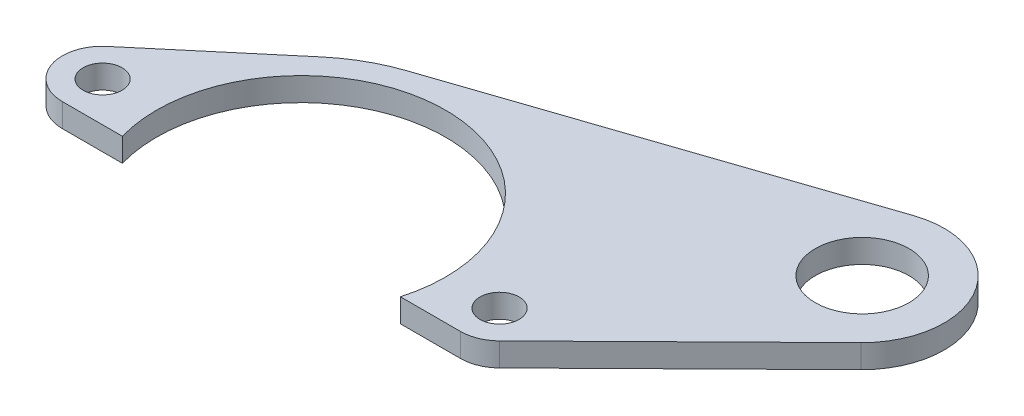
ISO-10303-21;
HEADER;
FILE_DESCRIPTION(('STEP AP214'),'2;1');
FILE_NAME('part.step','',(''),(''),'','','');
FILE_SCHEMA(('AUTOMOTIVE_DESIGN { 1 0 10303 214 1 1 1 1 }'));
ENDSEC;
DATA;
#1=APPLICATION_CONTEXT('core data for automotive mechanical design processes');
#2=APPLICATION_PROTOCOL_DEFINITION('international standard','automotive_design',2000,#1);
#3=PRODUCT_CONTEXT('',#1,'mechanical');
#4=PRODUCT('Part','Part','',(#3));
#5=PRODUCT_RELATED_PRODUCT_CATEGORY('part','',(#4));
#6=PRODUCT_DEFINITION_FORMATION('','',#4);
#7=PRODUCT_DEFINITION_CONTEXT('part definition',#1,'design');
#8=PRODUCT_DEFINITION('design','',#6,#7);
#9=PRODUCT_DEFINITION_SHAPE('','',#8);
#10=(LENGTH_UNIT() NAMED_UNIT(*) SI_UNIT(.MILLI.,.METRE.));
#11=(NAMED_UNIT(*) PLANE_ANGLE_UNIT() SI_UNIT($,.RADIAN.));
#12=(NAMED_UNIT(*) SI_UNIT($,.STERADIAN.) SOLID_ANGLE_UNIT());
#13=UNCERTAINTY_MEASURE_WITH_UNIT(LENGTH_MEASURE(1.E-05),#10,'distance_accuracy_value','');
#14=(GEOMETRIC_REPRESENTATION_CONTEXT(3) GLOBAL_UNCERTAINTY_ASSIGNED_CONTEXT((#13)) GLOBAL_UNIT_ASSIGNED_CONTEXT((#10,
#11,#12)) REPRESENTATION_CONTEXT('',''));
#15=CARTESIAN_POINT('',(0.,0.,0.));
#16=DIRECTION('',(0.,0.,1.));
#17=DIRECTION('',(1.,0.,0.));
#18=AXIS2_PLACEMENT_3D('',#15,#16,#17);
#19=CARTESIAN_POINT('',(25.47,3.,0.));
#20=DIRECTION('',(0.,1.,0.));
#21=DIRECTION('',(0.,0.,1.));
#22=AXIS2_PLACEMENT_3D('',#19,#20,#21);
#23=PLANE('',#22);
#24=CARTESIAN_POINT('',(25.4,3.,0.));
#25=DIRECTION('',(0.,1.,0.));
#26=DIRECTION('',(0.,0.,1.));
#27=AXIS2_PLACEMENT_3D('',#24,#25,#26);
#28=CIRCLE('',#27,2.5);
#29=CARTESIAN_POINT('',(25.4,3.,2.49999999999999));
#30=VERTEX_POINT('',#29);
#31=EDGE_CURVE('E255',#30,#30,#28,.T.);
#32=ORIENTED_EDGE('',*,*,#31,.F.);
#33=EDGE_LOOP('',(#32));
#34=FACE_BOUND('',#33,.T.);
#35=CARTESIAN_POINT('',(25.47,3.,0.));
#36=DIRECTION('',(0.,1.,0.));
#37=DIRECTION('',(0.,0.,1.));
#38=AXIS2_PLACEMENT_3D('',#35,#36,#37);
#39=CIRCLE('',#38,5.07999999999999);
#40=CARTESIAN_POINT('',(25.47,3.,5.08));
#41=VERTEX_POINT('',#40);
#42=CARTESIAN_POINT('',(29.0319519343451,3.,3.62200199025557));
#43=VERTEX_POINT('',#42);
#44=EDGE_CURVE('E188',#41,#43,#39,.T.);
#45=ORIENTED_EDGE('',*,*,#44,.T.);
#46=DIRECTION('',(0.712992517766848,0.,-0.701171640619107));
#47=VECTOR('',#46,1.);
#48=CARTESIAN_POINT('',(29.0319519343451,3.,3.62200199025557));
#49=LINE('',#48,#47);
#50=CARTESIAN_POINT('',(52.3623022265006,3.,-19.3215487244218));
#51=VERTEX_POINT('',#50);
#52=EDGE_CURVE('E112',#43,#51,#49,.T.);
#53=ORIENTED_EDGE('',*,*,#52,.T.);
#54=CARTESIAN_POINT('',(45.,3.,-26.8079701609737));
#55=DIRECTION('',(0.,1.,0.));
#56=DIRECTION('',(0.,0.,1.));
#57=AXIS2_PLACEMENT_3D('',#54,#55,#56);
#58=CIRCLE('',#57,10.5);
#59=CARTESIAN_POINT('',(41.6403222188692,3.,-36.7559631850452));
#60=VERTEX_POINT('',#59);
#61=EDGE_CURVE('E217',#51,#60,#58,.T.);
#62=ORIENTED_EDGE('',*,*,#61,.T.);
#63=DIRECTION('',(-0.947427907054434,0.,0.319969312488644));
#64=VECTOR('',#63,1.);
#65=CARTESIAN_POINT('',(-6.87934021850585,3.,-20.3697000016703));
#66=LINE('',#65,#64);
#67=CARTESIAN_POINT('',(-6.87934021850587,3.,-20.3697000016703));
#68=VERTEX_POINT('',#67);
#69=EDGE_CURVE('E237',#60,#68,#66,.T.);
#70=ORIENTED_EDGE('',*,*,#69,.T.);
#71=CARTESIAN_POINT('',(0.,3.,0.));
#72=DIRECTION('',(0.,1.,0.));
#73=DIRECTION('',(0.,0.,-1.));
#74=AXIS2_PLACEMENT_3D('',#71,#72,#73);
#75=CIRCLE('',#74,21.5);
#76=CARTESIAN_POINT('',(-13.8606203376522,3.,-16.4357294896048));
#77=VERTEX_POINT('',#76);
#78=EDGE_CURVE('E233',#68,#77,#75,.T.);
#79=ORIENTED_EDGE('',*,*,#78,.T.);
#80=DIRECTION('',(-0.764452534400221,0.,0.644680015704751));
#81=VECTOR('',#80,1.);
#82=CARTESIAN_POINT('',(-28.7449744797801,3.,-3.88341887475313));
#83=LINE('',#82,#81);
#84=CARTESIAN_POINT('',(-28.7449744797801,3.,-3.88341887475312));
#85=VERTEX_POINT('',#84);
#86=EDGE_CURVE('E236',#77,#85,#83,.T.);
#87=ORIENTED_EDGE('',*,*,#86,.T.);
#88=CARTESIAN_POINT('',(-25.47,3.,0.));
#89=DIRECTION('',(0.,1.,0.));
#90=DIRECTION('',(0.,0.,1.));
#91=AXIS2_PLACEMENT_3D('',#88,#89,#90);
#92=CIRCLE('',#91,5.08000000000001);
#93=CARTESIAN_POINT('',(-25.47,3.,5.08000000000001));
#94=VERTEX_POINT('',#93);
#95=EDGE_CURVE('E137',#85,#94,#92,.T.);
#96=ORIENTED_EDGE('',*,*,#95,.T.);
#97=DIRECTION('',(1.,0.,0.));
#98=VECTOR('',#97,1.);
#99=CARTESIAN_POINT('',(-17.7888616836491,3.,5.08000000000001));
#100=LINE('',#99,#98);
#101=CARTESIAN_POINT('',(-17.7888616836491,3.,5.08));
#102=VERTEX_POINT('',#101);
#103=EDGE_CURVE('E131',#94,#102,#100,.T.);
#104=ORIENTED_EDGE('',*,*,#103,.T.);
#105=CARTESIAN_POINT('',(0.,3.,0.));
#106=DIRECTION('',(0.,-1.,0.));
#107=DIRECTION('',(0.,0.,1.));
#108=AXIS2_PLACEMENT_3D('',#105,#106,#107);
#109=CIRCLE('',#108,18.5);
#110=CARTESIAN_POINT('',(17.7888616836491,3.,5.08));
#111=VERTEX_POINT('',#110);
#112=EDGE_CURVE('E135',#102,#111,#109,.T.);
#113=ORIENTED_EDGE('',*,*,#112,.T.);
#114=DIRECTION('',(1.,0.,0.));
#115=VECTOR('',#114,1.);
#116=CARTESIAN_POINT('',(25.47,3.,5.08));
#117=LINE('',#116,#115);
#118=EDGE_CURVE('E63',#111,#41,#117,.T.);
#119=ORIENTED_EDGE('',*,*,#118,.T.);
#120=EDGE_LOOP('',(#45,#53,#62,#70,#79,#87,#96,#104,#113,#119));
#121=FACE_BOUND('',#120,.T.);
#122=CARTESIAN_POINT('',(45.,3.,-26.8079701609737));
#123=DIRECTION('',(0.,1.,0.));
#124=DIRECTION('',(0.,0.,1.));
#125=AXIS2_PLACEMENT_3D('',#122,#123,#124);
#126=CIRCLE('',#125,6.);
#127=CARTESIAN_POINT('',(45.,3.,-20.8079701609737));
#128=VERTEX_POINT('',#127);
#129=EDGE_CURVE('E164',#128,#128,#126,.T.);
#130=ORIENTED_EDGE('',*,*,#129,.F.);
#131=EDGE_LOOP('',(#130));
#132=FACE_BOUND('',#131,.T.);
#133=CARTESIAN_POINT('',(-25.4,3.,0.));
#134=DIRECTION('',(0.,1.,0.));
#135=DIRECTION('',(0.,0.,1.));
#136=AXIS2_PLACEMENT_3D('',#133,#134,#135);
#137=CIRCLE('',#136,2.5);
#138=CARTESIAN_POINT('',(-25.4,3.,2.50000000000001));
#139=VERTEX_POINT('',#138);
#140=EDGE_CURVE('E263',#139,#139,#137,.T.);
#141=ORIENTED_EDGE('',*,*,#140,.F.);
#142=EDGE_LOOP('',(#141));
#143=FACE_BOUND('',#142,.T.);
#144=ADVANCED_FACE('F45',(#34,#121,#132,#143),#23,.T.);
#145=CARTESIAN_POINT('',(25.47,0.,0.));
#146=DIRECTION('',(0.,1.,0.));
#147=DIRECTION('',(0.,0.,1.));
#148=AXIS2_PLACEMENT_3D('',#145,#146,#147);
#149=PLANE('',#148);
#150=CARTESIAN_POINT('',(25.47,0.,0.));
#151=DIRECTION('',(0.,1.,0.));
#152=DIRECTION('',(0.,0.,1.));
#153=AXIS2_PLACEMENT_3D('',#150,#151,#152);
#154=CIRCLE('',#153,5.07999999999999);
#155=CARTESIAN_POINT('',(25.47,0.,5.08));
#156=VERTEX_POINT('',#155);
#157=CARTESIAN_POINT('',(29.0319519343451,0.,3.62200199025557));
#158=VERTEX_POINT('',#157);
#159=EDGE_CURVE('E159',#156,#158,#154,.T.);
#160=ORIENTED_EDGE('',*,*,#159,.F.);
#161=DIRECTION('',(1.,0.,0.));
#162=VECTOR('',#161,1.);
#163=CARTESIAN_POINT('',(25.47,0.,5.08));
#164=LINE('',#163,#162);
#165=CARTESIAN_POINT('',(17.7888616836491,0.,5.08));
#166=VERTEX_POINT('',#165);
#167=EDGE_CURVE('E104',#166,#156,#164,.T.);
#168=ORIENTED_EDGE('',*,*,#167,.F.);
#169=CARTESIAN_POINT('',(0.,0.,0.));
#170=DIRECTION('',(0.,-1.,0.));
#171=DIRECTION('',(0.,0.,1.));
#172=AXIS2_PLACEMENT_3D('',#169,#170,#171);
#173=CIRCLE('',#172,18.5);
#174=CARTESIAN_POINT('',(-17.7888616836491,0.,5.08));
#175=VERTEX_POINT('',#174);
#176=EDGE_CURVE('E98',#175,#166,#173,.T.);
#177=ORIENTED_EDGE('',*,*,#176,.F.);
#178=DIRECTION('',(1.,0.,0.));
#179=VECTOR('',#178,1.);
#180=CARTESIAN_POINT('',(-17.7888616836491,0.,5.08000000000001));
#181=LINE('',#180,#179);
#182=CARTESIAN_POINT('',(-25.47,0.,5.08000000000001));
#183=VERTEX_POINT('',#182);
#184=EDGE_CURVE('E146',#183,#175,#181,.T.);
#185=ORIENTED_EDGE('',*,*,#184,.F.);
#186=CARTESIAN_POINT('',(-25.47,0.,0.));
#187=DIRECTION('',(0.,1.,0.));
#188=DIRECTION('',(0.,0.,1.));
#189=AXIS2_PLACEMENT_3D('',#186,#187,#188);
#190=CIRCLE('',#189,5.08000000000001);
#191=CARTESIAN_POINT('',(-28.7449744797801,0.,-3.88341887475312));
#192=VERTEX_POINT('',#191);
#193=EDGE_CURVE('E179',#192,#183,#190,.T.);
#194=ORIENTED_EDGE('',*,*,#193,.F.);
#195=DIRECTION('',(-0.764452534400221,0.,0.644680015704751));
#196=VECTOR('',#195,1.);
#197=CARTESIAN_POINT('',(-28.7449744797801,0.,-3.88341887475313));
#198=LINE('',#197,#196);
#199=CARTESIAN_POINT('',(-13.8606203376522,0.,-16.4357294896048));
#200=VERTEX_POINT('',#199);
#201=EDGE_CURVE('E176',#200,#192,#198,.T.);
#202=ORIENTED_EDGE('',*,*,#201,.F.);
#203=CARTESIAN_POINT('',(0.,0.,0.));
#204=DIRECTION('',(0.,1.,0.));
#205=DIRECTION('',(0.,0.,-1.));
#206=AXIS2_PLACEMENT_3D('',#203,#204,#205);
#207=CIRCLE('',#206,21.5);
#208=CARTESIAN_POINT('',(-6.87934021850587,0.,-20.3697000016703));
#209=VERTEX_POINT('',#208);
#210=EDGE_CURVE('E173',#209,#200,#207,.T.);
#211=ORIENTED_EDGE('',*,*,#210,.F.);
#212=DIRECTION('',(-0.947427907054434,0.,0.319969312488644));
#213=VECTOR('',#212,1.);
#214=CARTESIAN_POINT('',(-6.87934021850585,0.,-20.3697000016703));
#215=LINE('',#214,#213);
#216=CARTESIAN_POINT('',(41.6403222188692,0.,-36.7559631850452));
#217=VERTEX_POINT('',#216);
#218=EDGE_CURVE('E170',#217,#209,#215,.T.);
#219=ORIENTED_EDGE('',*,*,#218,.F.);
#220=CARTESIAN_POINT('',(45.,0.,-26.8079701609737));
#221=DIRECTION('',(0.,1.,0.));
#222=DIRECTION('',(0.,0.,1.));
#223=AXIS2_PLACEMENT_3D('',#220,#221,#222);
#224=CIRCLE('',#223,10.5);
#225=CARTESIAN_POINT('',(52.3623022265006,0.,-19.3215487244218));
#226=VERTEX_POINT('',#225);
#227=EDGE_CURVE('E167',#226,#217,#224,.T.);
#228=ORIENTED_EDGE('',*,*,#227,.F.);
#229=DIRECTION('',(0.712992517766848,0.,-0.701171640619107));
#230=VECTOR('',#229,1.);
#231=CARTESIAN_POINT('',(29.0319519343451,0.,3.62200199025557));
#232=LINE('',#231,#230);
#233=EDGE_CURVE('E163',#158,#226,#232,.T.);
#234=ORIENTED_EDGE('',*,*,#233,.F.);
#235=EDGE_LOOP('',(#160,#168,#177,#185,#194,#202,#211,#219,#228,#234));
#236=FACE_BOUND('',#235,.T.);
#237=CARTESIAN_POINT('',(45.,0.,-26.8079701609737));
#238=DIRECTION('',(0.,1.,0.));
#239=DIRECTION('',(0.,0.,1.));
#240=AXIS2_PLACEMENT_3D('',#237,#238,#239);
#241=CIRCLE('',#240,6.);
#242=CARTESIAN_POINT('',(45.,0.,-20.8079701609737));
#243=VERTEX_POINT('',#242);
#244=EDGE_CURVE('E251',#243,#243,#241,.T.);
#245=ORIENTED_EDGE('',*,*,#244,.T.);
#246=EDGE_LOOP('',(#245));
#247=FACE_BOUND('',#246,.T.);
#248=CARTESIAN_POINT('',(25.4,0.,0.));
#249=DIRECTION('',(0.,1.,0.));
#250=DIRECTION('',(0.,0.,1.));
#251=AXIS2_PLACEMENT_3D('',#248,#249,#250);
#252=CIRCLE('',#251,2.5);
#253=CARTESIAN_POINT('',(25.4,0.,2.49999999999999));
#254=VERTEX_POINT('',#253);
#255=EDGE_CURVE('E259',#254,#254,#252,.T.);
#256=ORIENTED_EDGE('',*,*,#255,.T.);
#257=EDGE_LOOP('',(#256));
#258=FACE_BOUND('',#257,.T.);
#259=CARTESIAN_POINT('',(-25.4,0.,0.));
#260=DIRECTION('',(0.,1.,0.));
#261=DIRECTION('',(0.,0.,1.));
#262=AXIS2_PLACEMENT_3D('',#259,#260,#261);
#263=CIRCLE('',#262,2.5);
#264=CARTESIAN_POINT('',(-25.4,0.,2.50000000000001));
#265=VERTEX_POINT('',#264);
#266=EDGE_CURVE('E267',#265,#265,#263,.T.);
#267=ORIENTED_EDGE('',*,*,#266,.T.);
#268=EDGE_LOOP('',(#267));
#269=FACE_BOUND('',#268,.T.);
#270=ADVANCED_FACE('F221',(#236,#247,#258,#269),#149,.F.);
#271=CARTESIAN_POINT('',(25.47,3.,0.));
#272=DIRECTION('',(0.,-1.,0.));
#273=DIRECTION('',(0.,0.,-1.));
#274=AXIS2_PLACEMENT_3D('',#271,#272,#273);
#275=CYLINDRICAL_SURFACE('',#274,5.07999999999999);
#276=ORIENTED_EDGE('',*,*,#159,.T.);
#277=DIRECTION('',(0.,-1.,0.));
#278=VECTOR('',#277,1.);
#279=CARTESIAN_POINT('',(29.0319519343451,3.,3.62200199025557));
#280=LINE('',#279,#278);
#281=EDGE_CURVE('E11',#43,#158,#280,.T.);
#282=ORIENTED_EDGE('',*,*,#281,.F.);
#283=ORIENTED_EDGE('',*,*,#44,.F.);
#284=DIRECTION('',(0.,-1.,0.));
#285=VECTOR('',#284,1.);
#286=CARTESIAN_POINT('',(25.47,3.,5.08));
#287=LINE('',#286,#285);
#288=EDGE_CURVE('E155',#41,#156,#287,.T.);
#289=ORIENTED_EDGE('',*,*,#288,.T.);
#290=EDGE_LOOP('',(#276,#282,#283,#289));
#291=FACE_BOUND('',#290,.T.);
#292=ADVANCED_FACE('F47',(#291),#275,.T.);
#293=CARTESIAN_POINT('',(29.0319519343451,3.,3.62200199025557));
#294=DIRECTION('',(-0.701171640619107,0.,-0.712992517766849));
#295=DIRECTION('',(-0.712992517766849,0.,0.701171640619107));
#296=AXIS2_PLACEMENT_3D('',#293,#294,#295);
#297=PLANE('',#296);
#298=ORIENTED_EDGE('',*,*,#233,.T.);
#299=DIRECTION('',(0.,-1.,0.));
#300=VECTOR('',#299,1.);
#301=CARTESIAN_POINT('',(52.3623022265006,3.,-19.3215487244218));
#302=LINE('',#301,#300);
#303=EDGE_CURVE('E55',#51,#226,#302,.T.);
#304=ORIENTED_EDGE('',*,*,#303,.F.);
#305=ORIENTED_EDGE('',*,*,#52,.F.);
#306=ORIENTED_EDGE('',*,*,#281,.T.);
#307=EDGE_LOOP('',(#298,#304,#305,#306));
#308=FACE_BOUND('',#307,.T.);
#309=ADVANCED_FACE('F310',(#308),#297,.F.);
#310=CARTESIAN_POINT('',(45.,3.,-26.8079701609737));
#311=DIRECTION('',(0.,-1.,0.));
#312=DIRECTION('',(0.,0.,-1.));
#313=AXIS2_PLACEMENT_3D('',#310,#311,#312);
#314=CYLINDRICAL_SURFACE('',#313,10.5);
#315=ORIENTED_EDGE('',*,*,#227,.T.);
#316=DIRECTION('',(0.,-1.,0.));
#317=VECTOR('',#316,1.);
#318=CARTESIAN_POINT('',(41.6403222188692,3.,-36.7559631850452));
#319=LINE('',#318,#317);
#320=EDGE_CURVE('E207',#60,#217,#319,.T.);
#321=ORIENTED_EDGE('',*,*,#320,.F.);
#322=ORIENTED_EDGE('',*,*,#61,.F.);
#323=ORIENTED_EDGE('',*,*,#303,.T.);
#324=EDGE_LOOP('',(#315,#321,#322,#323));
#325=FACE_BOUND('',#324,.T.);
#326=ADVANCED_FACE('F215',(#325),#314,.T.);
#327=CARTESIAN_POINT('',(-6.87934021850585,3.,-20.3697000016703));
#328=DIRECTION('',(0.319969312488644,0.,0.947427907054433));
#329=DIRECTION('',(0.947427907054434,0.,-0.319969312488644));
#330=AXIS2_PLACEMENT_3D('',#327,#328,#329);
#331=PLANE('',#330);
#332=ORIENTED_EDGE('',*,*,#218,.T.);
#333=DIRECTION('',(0.,-1.,0.));
#334=VECTOR('',#333,1.);
#335=CARTESIAN_POINT('',(-6.87934021850587,3.,-20.3697000016703));
#336=LINE('',#335,#334);
#337=EDGE_CURVE('E203',#68,#209,#336,.T.);
#338=ORIENTED_EDGE('',*,*,#337,.F.);
#339=ORIENTED_EDGE('',*,*,#69,.F.);
#340=ORIENTED_EDGE('',*,*,#320,.T.);
#341=EDGE_LOOP('',(#332,#338,#339,#340));
#342=FACE_BOUND('',#341,.T.);
#343=ADVANCED_FACE('F227',(#342),#331,.F.);
#344=CARTESIAN_POINT('',(0.,3.,0.));
#345=DIRECTION('',(0.,-1.,0.));
#346=DIRECTION('',(0.,0.,-1.));
#347=AXIS2_PLACEMENT_3D('',#344,#345,#346);
#348=CYLINDRICAL_SURFACE('',#347,21.5);
#349=ORIENTED_EDGE('',*,*,#210,.T.);
#350=DIRECTION('',(0.,-1.,0.));
#351=VECTOR('',#350,1.);
#352=CARTESIAN_POINT('',(-13.8606203376522,3.,-16.4357294896048));
#353=LINE('',#352,#351);
#354=EDGE_CURVE('E199',#77,#200,#353,.T.);
#355=ORIENTED_EDGE('',*,*,#354,.F.);
#356=ORIENTED_EDGE('',*,*,#78,.F.);
#357=ORIENTED_EDGE('',*,*,#337,.T.);
#358=EDGE_LOOP('',(#349,#355,#356,#357));
#359=FACE_BOUND('',#358,.T.);
#360=ADVANCED_FACE('F231',(#359),#348,.T.);
#361=CARTESIAN_POINT('',(-28.7449744797801,3.,-3.88341887475313));
#362=DIRECTION('',(0.644680015704751,0.,0.764452534400222));
#363=DIRECTION('',(0.764452534400222,0.,-0.644680015704751));
#364=AXIS2_PLACEMENT_3D('',#361,#362,#363);
#365=PLANE('',#364);
#366=ORIENTED_EDGE('',*,*,#201,.T.);
#367=DIRECTION('',(0.,-1.,0.));
#368=VECTOR('',#367,1.);
#369=CARTESIAN_POINT('',(-28.7449744797801,3.,-3.88341887475312));
#370=LINE('',#369,#368);
#371=EDGE_CURVE('E195',#85,#192,#370,.T.);
#372=ORIENTED_EDGE('',*,*,#371,.F.);
#373=ORIENTED_EDGE('',*,*,#86,.F.);
#374=ORIENTED_EDGE('',*,*,#354,.T.);
#375=EDGE_LOOP('',(#366,#372,#373,#374));
#376=FACE_BOUND('',#375,.T.);
#377=ADVANCED_FACE('F300',(#376),#365,.F.);
#378=CARTESIAN_POINT('',(-25.47,3.,0.));
#379=DIRECTION('',(0.,-1.,0.));
#380=DIRECTION('',(0.,0.,-1.));
#381=AXIS2_PLACEMENT_3D('',#378,#379,#380);
#382=CYLINDRICAL_SURFACE('',#381,5.08000000000001);
#383=ORIENTED_EDGE('',*,*,#193,.T.);
#384=DIRECTION('',(0.,-1.,0.));
#385=VECTOR('',#384,1.);
#386=CARTESIAN_POINT('',(-25.47,3.,5.08000000000001));
#387=LINE('',#386,#385);
#388=EDGE_CURVE('E148',#94,#183,#387,.T.);
#389=ORIENTED_EDGE('',*,*,#388,.F.);
#390=ORIENTED_EDGE('',*,*,#95,.F.);
#391=ORIENTED_EDGE('',*,*,#371,.T.);
#392=EDGE_LOOP('',(#383,#389,#390,#391));
#393=FACE_BOUND('',#392,.T.);
#394=ADVANCED_FACE('F297',(#393),#382,.T.);
#395=CARTESIAN_POINT('',(-17.7888616836491,3.,5.08000000000001));
#396=DIRECTION('',(0.,0.,-1.));
#397=DIRECTION('',(-1.,0.,0.));
#398=AXIS2_PLACEMENT_3D('',#395,#396,#397);
#399=PLANE('',#398);
#400=ORIENTED_EDGE('',*,*,#184,.T.);
#401=DIRECTION('',(0.,-1.,0.));
#402=VECTOR('',#401,1.);
#403=CARTESIAN_POINT('',(-17.7888616836491,3.,5.08));
#404=LINE('',#403,#402);
#405=EDGE_CURVE('E143',#102,#175,#404,.T.);
#406=ORIENTED_EDGE('',*,*,#405,.F.);
#407=ORIENTED_EDGE('',*,*,#103,.F.);
#408=ORIENTED_EDGE('',*,*,#388,.T.);
#409=EDGE_LOOP('',(#400,#406,#407,#408));
#410=FACE_BOUND('',#409,.T.);
#411=ADVANCED_FACE('F144',(#410),#399,.F.);
#412=CARTESIAN_POINT('',(0.,3.,0.));
#413=DIRECTION('',(0.,-1.,0.));
#414=DIRECTION('',(0.,0.,-1.));
#415=AXIS2_PLACEMENT_3D('',#412,#413,#414);
#416=CYLINDRICAL_SURFACE('',#415,18.5);
#417=ORIENTED_EDGE('',*,*,#176,.T.);
#418=DIRECTION('',(0.,-1.,0.));
#419=VECTOR('',#418,1.);
#420=CARTESIAN_POINT('',(17.7888616836491,3.,5.08));
#421=LINE('',#420,#419);
#422=EDGE_CURVE('E149',#111,#166,#421,.T.);
#423=ORIENTED_EDGE('',*,*,#422,.F.);
#424=ORIENTED_EDGE('',*,*,#112,.F.);
#425=ORIENTED_EDGE('',*,*,#405,.T.);
#426=EDGE_LOOP('',(#417,#423,#424,#425));
#427=FACE_BOUND('',#426,.T.);
#428=ADVANCED_FACE('F151',(#427),#416,.F.);
#429=CARTESIAN_POINT('',(25.47,3.,5.08));
#430=DIRECTION('',(0.,0.,-1.));
#431=DIRECTION('',(-1.,0.,0.));
#432=AXIS2_PLACEMENT_3D('',#429,#430,#431);
#433=PLANE('',#432);
#434=ORIENTED_EDGE('',*,*,#167,.T.);
#435=ORIENTED_EDGE('',*,*,#288,.F.);
#436=ORIENTED_EDGE('',*,*,#118,.F.);
#437=ORIENTED_EDGE('',*,*,#422,.T.);
#438=EDGE_LOOP('',(#434,#435,#436,#437));
#439=FACE_BOUND('',#438,.T.);
#440=ADVANCED_FACE('F290',(#439),#433,.F.);
#441=CARTESIAN_POINT('',(45.,3.,-26.8079701609737));
#442=DIRECTION('',(0.,-1.,0.));
#443=DIRECTION('',(0.,0.,-1.));
#444=AXIS2_PLACEMENT_3D('',#441,#442,#443);
#445=CYLINDRICAL_SURFACE('',#444,6.);
#446=ORIENTED_EDGE('',*,*,#129,.T.);
#447=EDGE_LOOP('',(#446));
#448=FACE_BOUND('',#447,.T.);
#449=ORIENTED_EDGE('',*,*,#244,.F.);
#450=EDGE_LOOP('',(#449));
#451=FACE_BOUND('',#450,.T.);
#452=ADVANCED_FACE('F287',(#448,#451),#445,.F.);
#453=CARTESIAN_POINT('',(25.4,3.,0.));
#454=DIRECTION('',(0.,-1.,0.));
#455=DIRECTION('',(0.,0.,-1.));
#456=AXIS2_PLACEMENT_3D('',#453,#454,#455);
#457=CYLINDRICAL_SURFACE('',#456,2.5);
#458=ORIENTED_EDGE('',*,*,#31,.T.);
#459=EDGE_LOOP('',(#458));
#460=FACE_BOUND('',#459,.T.);
#461=ORIENTED_EDGE('',*,*,#255,.F.);
#462=EDGE_LOOP('',(#461));
#463=FACE_BOUND('',#462,.T.);
#464=ADVANCED_FACE('F385',(#460,#463),#457,.F.);
#465=CARTESIAN_POINT('',(-25.4,3.,0.));
#466=DIRECTION('',(0.,-1.,0.));
#467=DIRECTION('',(0.,0.,-1.));
#468=AXIS2_PLACEMENT_3D('',#465,#466,#467);
#469=CYLINDRICAL_SURFACE('',#468,2.5);
#470=ORIENTED_EDGE('',*,*,#140,.T.);
#471=EDGE_LOOP('',(#470));
#472=FACE_BOUND('',#471,.T.);
#473=ORIENTED_EDGE('',*,*,#266,.F.);
#474=EDGE_LOOP('',(#473));
#475=FACE_BOUND('',#474,.T.);
#476=ADVANCED_FACE('F275',(#472,#475),#469,.F.);
#477=CLOSED_SHELL('',(#144,#270,#292,#309,#326,#343,#360,#377,#394,#411,#428,#440,#452,#464,#476));
#478=MANIFOLD_SOLID_BREP('B2',#477);
#479=ADVANCED_BREP_SHAPE_REPRESENTATION('',(#18,#478),#14);
#480=SHAPE_DEFINITION_REPRESENTATION(#9,#479);
ENDSEC;
END-ISO-10303-21;
